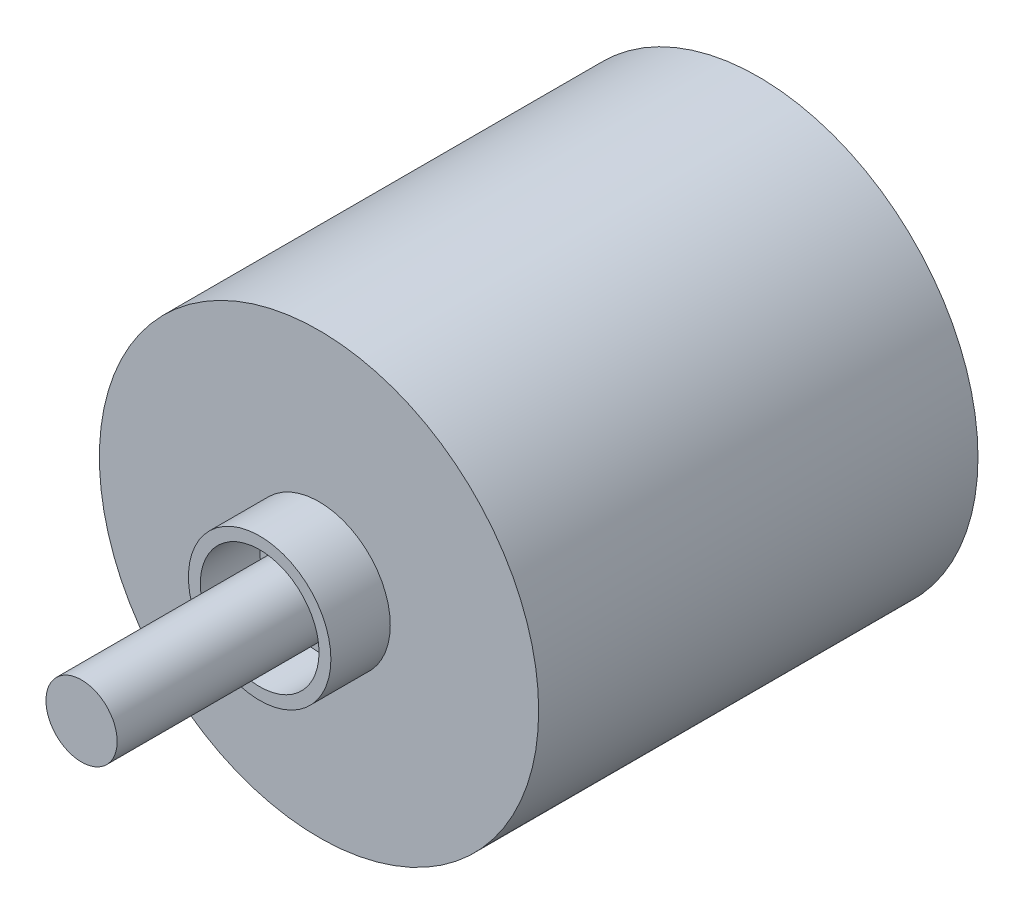
ISO-10303-21;
HEADER;
FILE_DESCRIPTION(('STEP AP214'),'2;1');
FILE_NAME('part.step','',(''),(''),'','','');
FILE_SCHEMA(('AUTOMOTIVE_DESIGN { 1 0 10303 214 1 1 1 1 }'));
ENDSEC;
DATA;
#1=APPLICATION_CONTEXT('core data for automotive mechanical design processes');
#2=APPLICATION_PROTOCOL_DEFINITION('international standard','automotive_design',2000,#1);
#3=PRODUCT_CONTEXT('',#1,'mechanical');
#4=PRODUCT('Part','Part','',(#3));
#5=PRODUCT_RELATED_PRODUCT_CATEGORY('part','',(#4));
#6=PRODUCT_DEFINITION_FORMATION('','',#4);
#7=PRODUCT_DEFINITION_CONTEXT('part definition',#1,'design');
#8=PRODUCT_DEFINITION('design','',#6,#7);
#9=PRODUCT_DEFINITION_SHAPE('','',#8);
#10=(LENGTH_UNIT() NAMED_UNIT(*) SI_UNIT(.MILLI.,.METRE.));
#11=(NAMED_UNIT(*) PLANE_ANGLE_UNIT() SI_UNIT($,.RADIAN.));
#12=(NAMED_UNIT(*) SI_UNIT($,.STERADIAN.) SOLID_ANGLE_UNIT());
#13=UNCERTAINTY_MEASURE_WITH_UNIT(LENGTH_MEASURE(1.E-05),#10,'distance_accuracy_value','');
#14=(GEOMETRIC_REPRESENTATION_CONTEXT(3) GLOBAL_UNCERTAINTY_ASSIGNED_CONTEXT((#13)) GLOBAL_UNIT_ASSIGNED_CONTEXT((#10,
#11,#12)) REPRESENTATION_CONTEXT('',''));
#15=CARTESIAN_POINT('',(0.,0.,0.));
#16=DIRECTION('',(0.,0.,1.));
#17=DIRECTION('',(1.,0.,0.));
#18=AXIS2_PLACEMENT_3D('',#15,#16,#17);
#19=CARTESIAN_POINT('',(0.,0.,0.));
#20=DIRECTION('',(0.,0.,1.));
#21=DIRECTION('',(1.,0.,0.));
#22=AXIS2_PLACEMENT_3D('',#19,#20,#21);
#23=PLANE('',#22);
#24=CARTESIAN_POINT('',(0.,15.5,0.));
#25=DIRECTION('',(0.,0.,-1.));
#26=DIRECTION('',(-1.,0.,0.));
#27=AXIS2_PLACEMENT_3D('',#24,#25,#26);
#28=CIRCLE('',#27,1.69999999999999);
#29=CARTESIAN_POINT('',(-1.69999999999999,15.5,0.));
#30=VERTEX_POINT('',#29);
#31=EDGE_CURVE('E103',#30,#30,#28,.T.);
#32=ORIENTED_EDGE('',*,*,#31,.F.);
#33=EDGE_LOOP('',(#32));
#34=FACE_BOUND('',#33,.T.);
#35=CARTESIAN_POINT('',(-13.4233937586604,7.75000000000286,0.));
#36=DIRECTION('',(0.,0.,-1.));
#37=DIRECTION('',(-1.,0.,0.));
#38=AXIS2_PLACEMENT_3D('',#35,#36,#37);
#39=CIRCLE('',#38,1.69999999999999);
#40=CARTESIAN_POINT('',(-15.1233937586604,7.75000000000286,0.));
#41=VERTEX_POINT('',#40);
#42=EDGE_CURVE('E97',#41,#41,#39,.T.);
#43=ORIENTED_EDGE('',*,*,#42,.F.);
#44=EDGE_LOOP('',(#43));
#45=FACE_BOUND('',#44,.T.);
#46=CARTESIAN_POINT('',(-13.4233937586638,-7.74999999999714,0.));
#47=DIRECTION('',(0.,0.,-1.));
#48=DIRECTION('',(-1.,0.,0.));
#49=AXIS2_PLACEMENT_3D('',#46,#47,#48);
#50=CIRCLE('',#49,1.69999999999999);
#51=CARTESIAN_POINT('',(-15.1233937586637,-7.74999999999714,0.));
#52=VERTEX_POINT('',#51);
#53=EDGE_CURVE('E91',#52,#52,#50,.T.);
#54=ORIENTED_EDGE('',*,*,#53,.F.);
#55=EDGE_LOOP('',(#54));
#56=FACE_BOUND('',#55,.T.);
#57=CARTESIAN_POINT('',(-6.6023528349529E-12,-15.5,0.));
#58=DIRECTION('',(0.,0.,-1.));
#59=DIRECTION('',(-1.,0.,0.));
#60=AXIS2_PLACEMENT_3D('',#57,#58,#59);
#61=CIRCLE('',#60,1.69999999999999);
#62=CARTESIAN_POINT('',(-1.70000000000659,-15.5,0.));
#63=VERTEX_POINT('',#62);
#64=EDGE_CURVE('E85',#63,#63,#61,.T.);
#65=ORIENTED_EDGE('',*,*,#64,.F.);
#66=EDGE_LOOP('',(#65));
#67=FACE_BOUND('',#66,.T.);
#68=CARTESIAN_POINT('',(13.4233937586538,-7.75000000000287,0.));
#69=DIRECTION('',(0.,0.,-1.));
#70=DIRECTION('',(-1.,0.,0.));
#71=AXIS2_PLACEMENT_3D('',#68,#69,#70);
#72=CIRCLE('',#71,1.69999999999999);
#73=CARTESIAN_POINT('',(11.7233937586539,-7.75000000000287,0.));
#74=VERTEX_POINT('',#73);
#75=EDGE_CURVE('E79',#74,#74,#72,.T.);
#76=ORIENTED_EDGE('',*,*,#75,.F.);
#77=EDGE_LOOP('',(#76));
#78=FACE_BOUND('',#77,.T.);
#79=CARTESIAN_POINT('',(0.,0.,0.));
#80=DIRECTION('',(0.,0.,1.));
#81=DIRECTION('',(1.,0.,0.));
#82=AXIS2_PLACEMENT_3D('',#79,#80,#81);
#83=CIRCLE('',#82,18.5);
#84=CARTESIAN_POINT('',(18.5,0.,0.));
#85=VERTEX_POINT('',#84);
#86=EDGE_CURVE('E49',#85,#85,#83,.T.);
#87=ORIENTED_EDGE('',*,*,#86,.F.);
#88=EDGE_LOOP('',(#87));
#89=FACE_BOUND('',#88,.T.);
#90=CARTESIAN_POINT('',(13.4233937586572,7.74999999999714,0.));
#91=DIRECTION('',(0.,0.,-1.));
#92=DIRECTION('',(-1.,0.,0.));
#93=AXIS2_PLACEMENT_3D('',#90,#91,#92);
#94=CIRCLE('',#93,1.69999999999999);
#95=CARTESIAN_POINT('',(11.7233937586572,7.74999999999714,0.));
#96=VERTEX_POINT('',#95);
#97=EDGE_CURVE('E73',#96,#96,#94,.T.);
#98=ORIENTED_EDGE('',*,*,#97,.F.);
#99=EDGE_LOOP('',(#98));
#100=FACE_BOUND('',#99,.T.);
#101=ADVANCED_FACE('F38',(#34,#45,#56,#67,#78,#89,#100),#23,.F.);
#102=CARTESIAN_POINT('',(0.,0.,37.));
#103=DIRECTION('',(0.,0.,-1.));
#104=DIRECTION('',(-1.,0.,0.));
#105=AXIS2_PLACEMENT_3D('',#102,#103,#104);
#106=CYLINDRICAL_SURFACE('',#105,18.5);
#107=CARTESIAN_POINT('',(0.,0.,37.));
#108=DIRECTION('',(0.,0.,1.));
#109=DIRECTION('',(1.,0.,0.));
#110=AXIS2_PLACEMENT_3D('',#107,#108,#109);
#111=CIRCLE('',#110,18.5);
#112=CARTESIAN_POINT('',(18.5,0.,37.));
#113=VERTEX_POINT('',#112);
#114=EDGE_CURVE('E45',#113,#113,#111,.T.);
#115=ORIENTED_EDGE('',*,*,#114,.F.);
#116=EDGE_LOOP('',(#115));
#117=FACE_BOUND('',#116,.T.);
#118=ORIENTED_EDGE('',*,*,#86,.T.);
#119=EDGE_LOOP('',(#118));
#120=FACE_BOUND('',#119,.T.);
#121=ADVANCED_FACE('F40',(#117,#120),#106,.T.);
#122=CARTESIAN_POINT('',(0.,0.,37.));
#123=DIRECTION('',(0.,0.,1.));
#124=DIRECTION('',(1.,0.,0.));
#125=AXIS2_PLACEMENT_3D('',#122,#123,#124);
#126=PLANE('',#125);
#127=CARTESIAN_POINT('',(0.,0.,37.));
#128=DIRECTION('',(0.,0.,1.));
#129=DIRECTION('',(1.,0.,0.));
#130=AXIS2_PLACEMENT_3D('',#127,#128,#129);
#131=CIRCLE('',#130,6.);
#132=CARTESIAN_POINT('',(6.,0.,37.));
#133=VERTEX_POINT('',#132);
#134=EDGE_CURVE('E56',#133,#133,#131,.T.);
#135=ORIENTED_EDGE('',*,*,#134,.F.);
#136=EDGE_LOOP('',(#135));
#137=FACE_BOUND('',#136,.T.);
#138=ORIENTED_EDGE('',*,*,#114,.T.);
#139=EDGE_LOOP('',(#138));
#140=FACE_BOUND('',#139,.T.);
#141=ADVANCED_FACE('F161',(#137,#140),#126,.T.);
#142=CARTESIAN_POINT('',(0.,0.,42.));
#143=DIRECTION('',(0.,0.,-1.));
#144=DIRECTION('',(-1.,0.,0.));
#145=AXIS2_PLACEMENT_3D('',#142,#143,#144);
#146=CYLINDRICAL_SURFACE('',#145,5.);
#147=CARTESIAN_POINT('',(0.,0.,42.));
#148=DIRECTION('',(0.,0.,1.));
#149=DIRECTION('',(1.,0.,0.));
#150=AXIS2_PLACEMENT_3D('',#147,#148,#149);
#151=CIRCLE('',#150,5.);
#152=CARTESIAN_POINT('',(5.,0.,42.));
#153=VERTEX_POINT('',#152);
#154=EDGE_CURVE('E59',#153,#153,#151,.T.);
#155=ORIENTED_EDGE('',*,*,#154,.T.);
#156=EDGE_LOOP('',(#155));
#157=FACE_BOUND('',#156,.T.);
#158=CARTESIAN_POINT('',(0.,0.,37.));
#159=DIRECTION('',(0.,0.,1.));
#160=DIRECTION('',(1.,0.,0.));
#161=AXIS2_PLACEMENT_3D('',#158,#159,#160);
#162=CIRCLE('',#161,5.);
#163=CARTESIAN_POINT('',(5.,0.,37.));
#164=VERTEX_POINT('',#163);
#165=EDGE_CURVE('E10',#164,#164,#162,.F.);
#166=ORIENTED_EDGE('',*,*,#165,.T.);
#167=EDGE_LOOP('',(#166));
#168=FACE_BOUND('',#167,.T.);
#169=ADVANCED_FACE('F157',(#157,#168),#146,.F.);
#170=CARTESIAN_POINT('',(0.,0.,42.));
#171=DIRECTION('',(0.,0.,-1.));
#172=DIRECTION('',(-1.,0.,0.));
#173=AXIS2_PLACEMENT_3D('',#170,#171,#172);
#174=CYLINDRICAL_SURFACE('',#173,6.);
#175=CARTESIAN_POINT('',(0.,0.,42.));
#176=DIRECTION('',(0.,0.,1.));
#177=DIRECTION('',(1.,0.,0.));
#178=AXIS2_PLACEMENT_3D('',#175,#176,#177);
#179=CIRCLE('',#178,6.);
#180=CARTESIAN_POINT('',(6.,0.,42.));
#181=VERTEX_POINT('',#180);
#182=EDGE_CURVE('E54',#181,#181,#179,.T.);
#183=ORIENTED_EDGE('',*,*,#182,.F.);
#184=EDGE_LOOP('',(#183));
#185=FACE_BOUND('',#184,.T.);
#186=ORIENTED_EDGE('',*,*,#134,.T.);
#187=EDGE_LOOP('',(#186));
#188=FACE_BOUND('',#187,.T.);
#189=ADVANCED_FACE('F153',(#185,#188),#174,.T.);
#190=CARTESIAN_POINT('',(0.,0.,42.));
#191=DIRECTION('',(0.,0.,1.));
#192=DIRECTION('',(1.,0.,0.));
#193=AXIS2_PLACEMENT_3D('',#190,#191,#192);
#194=PLANE('',#193);
#195=ORIENTED_EDGE('',*,*,#154,.F.);
#196=EDGE_LOOP('',(#195));
#197=FACE_BOUND('',#196,.T.);
#198=ORIENTED_EDGE('',*,*,#182,.T.);
#199=EDGE_LOOP('',(#198));
#200=FACE_BOUND('',#199,.T.);
#201=ADVANCED_FACE('F150',(#197,#200),#194,.T.);
#202=CARTESIAN_POINT('',(0.,0.,37.));
#203=DIRECTION('',(0.,0.,1.));
#204=DIRECTION('',(1.,0.,0.));
#205=AXIS2_PLACEMENT_3D('',#202,#203,#204);
#206=CIRCLE('',#205,3.);
#207=CARTESIAN_POINT('',(3.,0.,37.));
#208=VERTEX_POINT('',#207);
#209=EDGE_CURVE('E65',#208,#208,#206,.T.);
#210=ORIENTED_EDGE('',*,*,#209,.F.);
#211=EDGE_LOOP('',(#210));
#212=FACE_BOUND('',#211,.T.);
#213=ORIENTED_EDGE('',*,*,#165,.F.);
#214=EDGE_LOOP('',(#213));
#215=FACE_BOUND('',#214,.T.);
#216=ADVANCED_FACE('F148',(#212,#215),#126,.T.);
#217=CARTESIAN_POINT('',(0.,0.,57.));
#218=DIRECTION('',(0.,0.,-1.));
#219=DIRECTION('',(-1.,0.,0.));
#220=AXIS2_PLACEMENT_3D('',#217,#218,#219);
#221=CYLINDRICAL_SURFACE('',#220,3.);
#222=CARTESIAN_POINT('',(0.,0.,57.));
#223=DIRECTION('',(0.,0.,1.));
#224=DIRECTION('',(1.,0.,0.));
#225=AXIS2_PLACEMENT_3D('',#222,#223,#224);
#226=CIRCLE('',#225,3.);
#227=CARTESIAN_POINT('',(3.,0.,57.));
#228=VERTEX_POINT('',#227);
#229=EDGE_CURVE('E60',#228,#228,#226,.T.);
#230=ORIENTED_EDGE('',*,*,#229,.F.);
#231=EDGE_LOOP('',(#230));
#232=FACE_BOUND('',#231,.T.);
#233=ORIENTED_EDGE('',*,*,#209,.T.);
#234=EDGE_LOOP('',(#233));
#235=FACE_BOUND('',#234,.T.);
#236=ADVANCED_FACE('F144',(#232,#235),#221,.T.);
#237=CARTESIAN_POINT('',(0.,0.,57.));
#238=DIRECTION('',(0.,0.,1.));
#239=DIRECTION('',(1.,0.,0.));
#240=AXIS2_PLACEMENT_3D('',#237,#238,#239);
#241=PLANE('',#240);
#242=ORIENTED_EDGE('',*,*,#229,.T.);
#243=EDGE_LOOP('',(#242));
#244=FACE_BOUND('',#243,.T.);
#245=ADVANCED_FACE('F136',(#244),#241,.T.);
#246=CARTESIAN_POINT('',(13.4233937586571,7.74999999999714,5.));
#247=DIRECTION('',(0.,0.,1.));
#248=DIRECTION('',(1.,0.,0.));
#249=AXIS2_PLACEMENT_3D('',#246,#247,#248);
#250=PLANE('',#249);
#251=CARTESIAN_POINT('',(13.4233937586572,7.74999999999714,5.));
#252=DIRECTION('',(0.,0.,-1.));
#253=DIRECTION('',(-1.,0.,0.));
#254=AXIS2_PLACEMENT_3D('',#251,#252,#253);
#255=CIRCLE('',#254,1.7);
#256=CARTESIAN_POINT('',(11.7233937586571,7.74999999999714,5.));
#257=VERTEX_POINT('',#256);
#258=EDGE_CURVE('E68',#257,#257,#255,.T.);
#259=ORIENTED_EDGE('',*,*,#258,.T.);
#260=EDGE_LOOP('',(#259));
#261=FACE_BOUND('',#260,.T.);
#262=ADVANCED_FACE('F126',(#261),#250,.F.);
#263=CARTESIAN_POINT('',(13.4233937586572,7.74999999999714,0.));
#264=DIRECTION('',(0.,0.,-1.));
#265=DIRECTION('',(-1.,0.,0.));
#266=AXIS2_PLACEMENT_3D('',#263,#264,#265);
#267=CYLINDRICAL_SURFACE('',#266,1.69999999999999);
#268=ORIENTED_EDGE('',*,*,#258,.F.);
#269=EDGE_LOOP('',(#268));
#270=FACE_BOUND('',#269,.T.);
#271=ORIENTED_EDGE('',*,*,#97,.T.);
#272=EDGE_LOOP('',(#271));
#273=FACE_BOUND('',#272,.T.);
#274=ADVANCED_FACE('F123',(#270,#273),#267,.F.);
#275=CARTESIAN_POINT('',(13.4233937586538,-7.75000000000287,5.));
#276=DIRECTION('',(0.,0.,1.));
#277=DIRECTION('',(1.,0.,0.));
#278=AXIS2_PLACEMENT_3D('',#275,#276,#277);
#279=PLANE('',#278);
#280=CARTESIAN_POINT('',(13.4233937586538,-7.75000000000287,5.));
#281=DIRECTION('',(0.,0.,-1.));
#282=DIRECTION('',(-1.,0.,0.));
#283=AXIS2_PLACEMENT_3D('',#280,#281,#282);
#284=CIRCLE('',#283,1.7);
#285=CARTESIAN_POINT('',(11.7233937586538,-7.75000000000287,5.));
#286=VERTEX_POINT('',#285);
#287=EDGE_CURVE('E76',#286,#286,#284,.T.);
#288=ORIENTED_EDGE('',*,*,#287,.T.);
#289=EDGE_LOOP('',(#288));
#290=FACE_BOUND('',#289,.T.);
#291=ADVANCED_FACE('F125',(#290),#279,.F.);
#292=CARTESIAN_POINT('',(13.4233937586538,-7.75000000000287,0.));
#293=DIRECTION('',(0.,0.,-1.));
#294=DIRECTION('',(-1.,0.,0.));
#295=AXIS2_PLACEMENT_3D('',#292,#293,#294);
#296=CYLINDRICAL_SURFACE('',#295,1.69999999999999);
#297=ORIENTED_EDGE('',*,*,#287,.F.);
#298=EDGE_LOOP('',(#297));
#299=FACE_BOUND('',#298,.T.);
#300=ORIENTED_EDGE('',*,*,#75,.T.);
#301=EDGE_LOOP('',(#300));
#302=FACE_BOUND('',#301,.T.);
#303=ADVANCED_FACE('F133',(#299,#302),#296,.F.);
#304=CARTESIAN_POINT('',(-6.60357748175205E-12,-15.5,5.));
#305=DIRECTION('',(0.,0.,1.));
#306=DIRECTION('',(1.,0.,0.));
#307=AXIS2_PLACEMENT_3D('',#304,#305,#306);
#308=PLANE('',#307);
#309=CARTESIAN_POINT('',(-6.6023528349529E-12,-15.5,5.));
#310=DIRECTION('',(0.,0.,-1.));
#311=DIRECTION('',(-1.,0.,0.));
#312=AXIS2_PLACEMENT_3D('',#309,#310,#311);
#313=CIRCLE('',#312,1.7);
#314=CARTESIAN_POINT('',(-1.7000000000066,-15.5,5.));
#315=VERTEX_POINT('',#314);
#316=EDGE_CURVE('E82',#315,#315,#313,.T.);
#317=ORIENTED_EDGE('',*,*,#316,.T.);
#318=EDGE_LOOP('',(#317));
#319=FACE_BOUND('',#318,.T.);
#320=ADVANCED_FACE('F213',(#319),#308,.F.);
#321=CARTESIAN_POINT('',(-6.6023528349529E-12,-15.5,0.));
#322=DIRECTION('',(0.,0.,-1.));
#323=DIRECTION('',(-1.,0.,0.));
#324=AXIS2_PLACEMENT_3D('',#321,#322,#323);
#325=CYLINDRICAL_SURFACE('',#324,1.69999999999999);
#326=ORIENTED_EDGE('',*,*,#316,.F.);
#327=EDGE_LOOP('',(#326));
#328=FACE_BOUND('',#327,.T.);
#329=ORIENTED_EDGE('',*,*,#64,.T.);
#330=EDGE_LOOP('',(#329));
#331=FACE_BOUND('',#330,.T.);
#332=ADVANCED_FACE('F222',(#328,#331),#325,.F.);
#333=CARTESIAN_POINT('',(-13.4233937586638,-7.74999999999714,5.));
#334=DIRECTION('',(0.,0.,1.));
#335=DIRECTION('',(1.,0.,0.));
#336=AXIS2_PLACEMENT_3D('',#333,#334,#335);
#337=PLANE('',#336);
#338=CARTESIAN_POINT('',(-13.4233937586638,-7.74999999999714,5.));
#339=DIRECTION('',(0.,0.,-1.));
#340=DIRECTION('',(-1.,0.,0.));
#341=AXIS2_PLACEMENT_3D('',#338,#339,#340);
#342=CIRCLE('',#341,1.7);
#343=CARTESIAN_POINT('',(-15.1233937586638,-7.74999999999714,5.));
#344=VERTEX_POINT('',#343);
#345=EDGE_CURVE('E88',#344,#344,#342,.T.);
#346=ORIENTED_EDGE('',*,*,#345,.T.);
#347=EDGE_LOOP('',(#346));
#348=FACE_BOUND('',#347,.T.);
#349=ADVANCED_FACE('F232',(#348),#337,.F.);
#350=CARTESIAN_POINT('',(-13.4233937586638,-7.74999999999714,0.));
#351=DIRECTION('',(0.,0.,-1.));
#352=DIRECTION('',(-1.,0.,0.));
#353=AXIS2_PLACEMENT_3D('',#350,#351,#352);
#354=CYLINDRICAL_SURFACE('',#353,1.69999999999999);
#355=ORIENTED_EDGE('',*,*,#345,.F.);
#356=EDGE_LOOP('',(#355));
#357=FACE_BOUND('',#356,.T.);
#358=ORIENTED_EDGE('',*,*,#53,.T.);
#359=EDGE_LOOP('',(#358));
#360=FACE_BOUND('',#359,.T.);
#361=ADVANCED_FACE('F242',(#357,#360),#354,.F.);
#362=CARTESIAN_POINT('',(-13.4233937586604,7.75000000000286,5.));
#363=DIRECTION('',(0.,0.,1.));
#364=DIRECTION('',(1.,0.,0.));
#365=AXIS2_PLACEMENT_3D('',#362,#363,#364);
#366=PLANE('',#365);
#367=CARTESIAN_POINT('',(-13.4233937586604,7.75000000000286,5.));
#368=DIRECTION('',(0.,0.,-1.));
#369=DIRECTION('',(-1.,0.,0.));
#370=AXIS2_PLACEMENT_3D('',#367,#368,#369);
#371=CIRCLE('',#370,1.7);
#372=CARTESIAN_POINT('',(-15.1233937586604,7.75000000000286,5.));
#373=VERTEX_POINT('',#372);
#374=EDGE_CURVE('E94',#373,#373,#371,.T.);
#375=ORIENTED_EDGE('',*,*,#374,.T.);
#376=EDGE_LOOP('',(#375));
#377=FACE_BOUND('',#376,.T.);
#378=ADVANCED_FACE('F252',(#377),#366,.F.);
#379=CARTESIAN_POINT('',(-13.4233937586604,7.75000000000286,0.));
#380=DIRECTION('',(0.,0.,-1.));
#381=DIRECTION('',(-1.,0.,0.));
#382=AXIS2_PLACEMENT_3D('',#379,#380,#381);
#383=CYLINDRICAL_SURFACE('',#382,1.69999999999999);
#384=ORIENTED_EDGE('',*,*,#374,.F.);
#385=EDGE_LOOP('',(#384));
#386=FACE_BOUND('',#385,.T.);
#387=ORIENTED_EDGE('',*,*,#42,.T.);
#388=EDGE_LOOP('',(#387));
#389=FACE_BOUND('',#388,.T.);
#390=ADVANCED_FACE('F262',(#386,#389),#383,.F.);
#391=CARTESIAN_POINT('',(0.,15.5,5.));
#392=DIRECTION('',(0.,0.,1.));
#393=DIRECTION('',(1.,0.,0.));
#394=AXIS2_PLACEMENT_3D('',#391,#392,#393);
#395=PLANE('',#394);
#396=CARTESIAN_POINT('',(0.,15.5,5.));
#397=DIRECTION('',(0.,0.,-1.));
#398=DIRECTION('',(-1.,0.,0.));
#399=AXIS2_PLACEMENT_3D('',#396,#397,#398);
#400=CIRCLE('',#399,1.7);
#401=CARTESIAN_POINT('',(-1.7,15.5,5.));
#402=VERTEX_POINT('',#401);
#403=EDGE_CURVE('E100',#402,#402,#400,.T.);
#404=ORIENTED_EDGE('',*,*,#403,.T.);
#405=EDGE_LOOP('',(#404));
#406=FACE_BOUND('',#405,.T.);
#407=ADVANCED_FACE('F272',(#406),#395,.F.);
#408=CARTESIAN_POINT('',(0.,15.5,0.));
#409=DIRECTION('',(0.,0.,-1.));
#410=DIRECTION('',(-1.,0.,0.));
#411=AXIS2_PLACEMENT_3D('',#408,#409,#410);
#412=CYLINDRICAL_SURFACE('',#411,1.69999999999999);
#413=ORIENTED_EDGE('',*,*,#403,.F.);
#414=EDGE_LOOP('',(#413));
#415=FACE_BOUND('',#414,.T.);
#416=ORIENTED_EDGE('',*,*,#31,.T.);
#417=EDGE_LOOP('',(#416));
#418=FACE_BOUND('',#417,.T.);
#419=ADVANCED_FACE('F107',(#415,#418),#412,.F.);
#420=CLOSED_SHELL('',(#101,#121,#141,#169,#189,#201,#216,#236,#245,#262,#274,#291,#303,#320,
#332,#349,#361,#378,#390,#407,#419));
#421=MANIFOLD_SOLID_BREP('B2',#420);
#422=ADVANCED_BREP_SHAPE_REPRESENTATION('',(#18,#421),#14);
#423=SHAPE_DEFINITION_REPRESENTATION(#9,#422);
ENDSEC;
END-ISO-10303-21;
